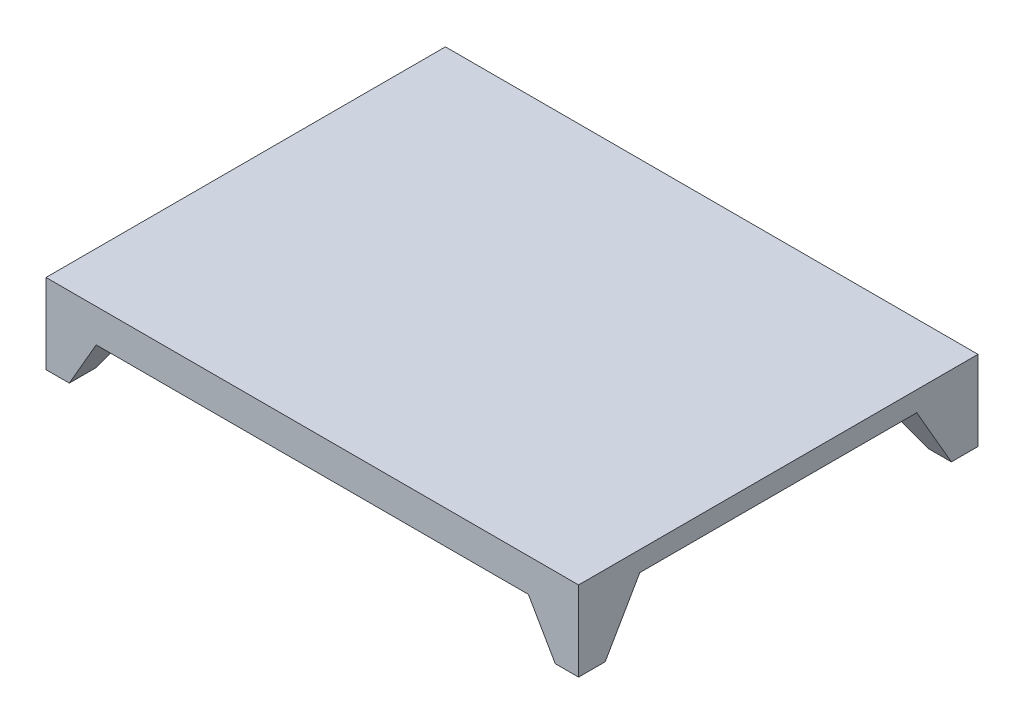
ISO-10303-21;
HEADER;
FILE_DESCRIPTION(('STEP AP214'),'2;1');
FILE_NAME('part.step','',(''),(''),'','','');
FILE_SCHEMA(('AUTOMOTIVE_DESIGN { 1 0 10303 214 1 1 1 1 }'));
ENDSEC;
DATA;
#1=APPLICATION_CONTEXT('core data for automotive mechanical design processes');
#2=APPLICATION_PROTOCOL_DEFINITION('international standard','automotive_design',2000,#1);
#3=PRODUCT_CONTEXT('',#1,'mechanical');
#4=PRODUCT('Part','Part','',(#3));
#5=PRODUCT_RELATED_PRODUCT_CATEGORY('part','',(#4));
#6=PRODUCT_DEFINITION_FORMATION('','',#4);
#7=PRODUCT_DEFINITION_CONTEXT('part definition',#1,'design');
#8=PRODUCT_DEFINITION('design','',#6,#7);
#9=PRODUCT_DEFINITION_SHAPE('','',#8);
#10=(LENGTH_UNIT() NAMED_UNIT(*) SI_UNIT(.MILLI.,.METRE.));
#11=(NAMED_UNIT(*) PLANE_ANGLE_UNIT() SI_UNIT($,.RADIAN.));
#12=(NAMED_UNIT(*) SI_UNIT($,.STERADIAN.) SOLID_ANGLE_UNIT());
#13=UNCERTAINTY_MEASURE_WITH_UNIT(LENGTH_MEASURE(1.E-05),#10,'distance_accuracy_value','');
#14=(GEOMETRIC_REPRESENTATION_CONTEXT(3) GLOBAL_UNCERTAINTY_ASSIGNED_CONTEXT((#13)) GLOBAL_UNIT_ASSIGNED_CONTEXT((#10,
#11,#12)) REPRESENTATION_CONTEXT('',''));
#15=CARTESIAN_POINT('',(0.,0.,0.));
#16=DIRECTION('',(0.,0.,1.));
#17=DIRECTION('',(1.,0.,0.));
#18=AXIS2_PLACEMENT_3D('',#15,#16,#17);
#19=CARTESIAN_POINT('',(-400.,-60.,300.));
#20=DIRECTION('',(0.,1.,0.));
#21=DIRECTION('',(0.,0.,1.));
#22=AXIS2_PLACEMENT_3D('',#19,#20,#21);
#23=PLANE('',#22);
#24=DIRECTION('',(0.,0.,1.));
#25=VECTOR('',#24,1.);
#26=CARTESIAN_POINT('',(-365.,-60.,-300.));
#27=LINE('',#26,#25);
#28=CARTESIAN_POINT('',(-365.,-60.,260.));
#29=VERTEX_POINT('',#28);
#30=CARTESIAN_POINT('',(-365.,-60.,300.));
#31=VERTEX_POINT('',#30);
#32=EDGE_CURVE('E205',#29,#31,#27,.T.);
#33=ORIENTED_EDGE('',*,*,#32,.T.);
#34=DIRECTION('',(1.,0.,0.));
#35=VECTOR('',#34,1.);
#36=CARTESIAN_POINT('',(-400.,-60.,300.));
#37=LINE('',#36,#35);
#38=CARTESIAN_POINT('',(-400.,-60.,300.));
#39=VERTEX_POINT('',#38);
#40=EDGE_CURVE('E231',#39,#31,#37,.T.);
#41=ORIENTED_EDGE('',*,*,#40,.F.);
#42=DIRECTION('',(0.,0.,-1.));
#43=VECTOR('',#42,1.);
#44=CARTESIAN_POINT('',(-400.,-60.,300.));
#45=LINE('',#44,#43);
#46=CARTESIAN_POINT('',(-400.,-60.,260.));
#47=VERTEX_POINT('',#46);
#48=EDGE_CURVE('E182',#39,#47,#45,.T.);
#49=ORIENTED_EDGE('',*,*,#48,.T.);
#50=DIRECTION('',(1.,0.,0.));
#51=VECTOR('',#50,1.);
#52=CARTESIAN_POINT('',(-400.,-60.,260.));
#53=LINE('',#52,#51);
#54=EDGE_CURVE('E234',#47,#29,#53,.T.);
#55=ORIENTED_EDGE('',*,*,#54,.T.);
#56=EDGE_LOOP('',(#33,#41,#49,#55));
#57=FACE_BOUND('',#56,.T.);
#58=ADVANCED_FACE('F33',(#57),#23,.F.);
#59=CARTESIAN_POINT('',(-365.,-60.,-300.));
#60=VERTEX_POINT('',#59);
#61=CARTESIAN_POINT('',(-365.,-60.,-260.));
#62=VERTEX_POINT('',#61);
#63=EDGE_CURVE('E247',#60,#62,#27,.T.);
#64=ORIENTED_EDGE('',*,*,#63,.T.);
#65=DIRECTION('',(1.,0.,0.));
#66=VECTOR('',#65,1.);
#67=CARTESIAN_POINT('',(-400.,-60.,-260.));
#68=LINE('',#67,#66);
#69=CARTESIAN_POINT('',(-400.,-60.,-260.));
#70=VERTEX_POINT('',#69);
#71=EDGE_CURVE('E211',#70,#62,#68,.T.);
#72=ORIENTED_EDGE('',*,*,#71,.F.);
#73=CARTESIAN_POINT('',(-400.,-60.,-300.));
#74=VERTEX_POINT('',#73);
#75=EDGE_CURVE('E180',#70,#74,#45,.T.);
#76=ORIENTED_EDGE('',*,*,#75,.T.);
#77=DIRECTION('',(1.,0.,0.));
#78=VECTOR('',#77,1.);
#79=CARTESIAN_POINT('',(-400.,-60.,-300.));
#80=LINE('',#79,#78);
#81=EDGE_CURVE('E167',#74,#60,#80,.T.);
#82=ORIENTED_EDGE('',*,*,#81,.T.);
#83=EDGE_LOOP('',(#64,#72,#76,#82));
#84=FACE_BOUND('',#83,.T.);
#85=ADVANCED_FACE('F246',(#84),#23,.F.);
#86=CARTESIAN_POINT('',(0.,0.,300.));
#87=DIRECTION('',(0.,0.,-1.));
#88=DIRECTION('',(-1.,0.,0.));
#89=AXIS2_PLACEMENT_3D('',#86,#87,#88);
#90=PLANE('',#89);
#91=DIRECTION('',(0.500000000000004,0.866025403784436,0.));
#92=VECTOR('',#91,1.);
#93=CARTESIAN_POINT('',(-247.769237886465,143.049636190661,300.));
#94=LINE('',#93,#92);
#95=CARTESIAN_POINT('',(-324.585481156726,10.,300.));
#96=VERTEX_POINT('',#95);
#97=EDGE_CURVE('E152',#31,#96,#94,.T.);
#98=ORIENTED_EDGE('',*,*,#97,.T.);
#99=DIRECTION('',(1.,0.,0.));
#100=VECTOR('',#99,1.);
#101=CARTESIAN_POINT('',(0.,10.,300.));
#102=LINE('',#101,#100);
#103=CARTESIAN_POINT('',(324.585481156726,10.,300.));
#104=VERTEX_POINT('',#103);
#105=EDGE_CURVE('E290',#96,#104,#102,.T.);
#106=ORIENTED_EDGE('',*,*,#105,.T.);
#107=DIRECTION('',(-0.500000000000004,0.866025403784437,0.));
#108=VECTOR('',#107,1.);
#109=CARTESIAN_POINT('',(247.769237886465,143.049636190661,300.));
#110=LINE('',#109,#108);
#111=CARTESIAN_POINT('',(365.,-60.,300.));
#112=VERTEX_POINT('',#111);
#113=EDGE_CURVE('E288',#112,#104,#110,.T.);
#114=ORIENTED_EDGE('',*,*,#113,.F.);
#115=CARTESIAN_POINT('',(400.,-60.,300.));
#116=VERTEX_POINT('',#115);
#117=EDGE_CURVE('E230',#112,#116,#37,.T.);
#118=ORIENTED_EDGE('',*,*,#117,.T.);
#119=DIRECTION('',(0.,1.,0.));
#120=VECTOR('',#119,1.);
#121=CARTESIAN_POINT('',(400.,-60.,300.));
#122=LINE('',#121,#120);
#123=CARTESIAN_POINT('',(400.,60.,300.));
#124=VERTEX_POINT('',#123);
#125=EDGE_CURVE('E171',#116,#124,#122,.T.);
#126=ORIENTED_EDGE('',*,*,#125,.T.);
#127=DIRECTION('',(-1.,0.,0.));
#128=VECTOR('',#127,1.);
#129=CARTESIAN_POINT('',(-400.,60.,300.));
#130=LINE('',#129,#128);
#131=CARTESIAN_POINT('',(-400.,60.,300.));
#132=VERTEX_POINT('',#131);
#133=EDGE_CURVE('E226',#124,#132,#130,.T.);
#134=ORIENTED_EDGE('',*,*,#133,.T.);
#135=DIRECTION('',(0.,-1.,0.));
#136=VECTOR('',#135,1.);
#137=CARTESIAN_POINT('',(-400.,-60.,300.));
#138=LINE('',#137,#136);
#139=EDGE_CURVE('E228',#132,#39,#138,.T.);
#140=ORIENTED_EDGE('',*,*,#139,.T.);
#141=ORIENTED_EDGE('',*,*,#40,.T.);
#142=EDGE_LOOP('',(#98,#106,#114,#118,#126,#134,#140,#141));
#143=FACE_BOUND('',#142,.T.);
#144=ADVANCED_FACE('F285',(#143),#90,.F.);
#145=CARTESIAN_POINT('',(0.,0.,-300.));
#146=DIRECTION('',(0.,0.,-1.));
#147=DIRECTION('',(-1.,0.,0.));
#148=AXIS2_PLACEMENT_3D('',#145,#146,#147);
#149=PLANE('',#148);
#150=DIRECTION('',(1.,0.,0.));
#151=VECTOR('',#150,1.);
#152=CARTESIAN_POINT('',(0.,10.,-300.));
#153=LINE('',#152,#151);
#154=CARTESIAN_POINT('',(-324.585481156726,10.,-300.));
#155=VERTEX_POINT('',#154);
#156=CARTESIAN_POINT('',(324.585481156726,10.,-300.));
#157=VERTEX_POINT('',#156);
#158=EDGE_CURVE('E151',#155,#157,#153,.T.);
#159=ORIENTED_EDGE('',*,*,#158,.F.);
#160=DIRECTION('',(0.500000000000004,0.866025403784436,0.));
#161=VECTOR('',#160,1.);
#162=CARTESIAN_POINT('',(-247.769237886465,143.049636190661,-300.));
#163=LINE('',#162,#161);
#164=EDGE_CURVE('E204',#60,#155,#163,.T.);
#165=ORIENTED_EDGE('',*,*,#164,.F.);
#166=ORIENTED_EDGE('',*,*,#81,.F.);
#167=DIRECTION('',(0.,-1.,0.));
#168=VECTOR('',#167,1.);
#169=CARTESIAN_POINT('',(-400.,-60.,-300.));
#170=LINE('',#169,#168);
#171=CARTESIAN_POINT('',(-400.,60.,-300.));
#172=VERTEX_POINT('',#171);
#173=EDGE_CURVE('E168',#172,#74,#170,.T.);
#174=ORIENTED_EDGE('',*,*,#173,.F.);
#175=DIRECTION('',(-1.,0.,0.));
#176=VECTOR('',#175,1.);
#177=CARTESIAN_POINT('',(-400.,60.,-300.));
#178=LINE('',#177,#176);
#179=CARTESIAN_POINT('',(400.,60.,-300.));
#180=VERTEX_POINT('',#179);
#181=EDGE_CURVE('E173',#180,#172,#178,.T.);
#182=ORIENTED_EDGE('',*,*,#181,.F.);
#183=DIRECTION('',(0.,1.,0.));
#184=VECTOR('',#183,1.);
#185=CARTESIAN_POINT('',(400.,-60.,-300.));
#186=LINE('',#185,#184);
#187=CARTESIAN_POINT('',(400.,-60.,-300.));
#188=VERTEX_POINT('',#187);
#189=EDGE_CURVE('E166',#188,#180,#186,.T.);
#190=ORIENTED_EDGE('',*,*,#189,.F.);
#191=CARTESIAN_POINT('',(365.,-60.,-300.));
#192=VERTEX_POINT('',#191);
#193=EDGE_CURVE('E158',#192,#188,#80,.T.);
#194=ORIENTED_EDGE('',*,*,#193,.F.);
#195=DIRECTION('',(-0.500000000000004,0.866025403784437,0.));
#196=VECTOR('',#195,1.);
#197=CARTESIAN_POINT('',(247.769237886465,143.049636190661,-300.));
#198=LINE('',#197,#196);
#199=EDGE_CURVE('E144',#192,#157,#198,.T.);
#200=ORIENTED_EDGE('',*,*,#199,.T.);
#201=EDGE_LOOP('',(#159,#165,#166,#174,#182,#190,#194,#200));
#202=FACE_BOUND('',#201,.T.);
#203=ADVANCED_FACE('F164',(#202),#149,.T.);
#204=CARTESIAN_POINT('',(-400.,97.5833024919774,169.019237886466));
#205=DIRECTION('',(0.,-0.500000000000004,-0.866025403784436));
#206=DIRECTION('',(0.,0.866025403784437,-0.500000000000004));
#207=AXIS2_PLACEMENT_3D('',#204,#205,#206);
#208=PLANE('',#207);
#209=DIRECTION('',(-1.,0.,0.));
#210=VECTOR('',#209,1.);
#211=CARTESIAN_POINT('',(-400.,10.,219.585481156726));
#212=LINE('',#211,#210);
#213=CARTESIAN_POINT('',(324.585481156726,9.99999999999995,219.585481156726));
#214=VERTEX_POINT('',#213);
#215=CARTESIAN_POINT('',(-324.585481156726,10.,219.585481156726));
#216=VERTEX_POINT('',#215);
#217=EDGE_CURVE('E300',#214,#216,#212,.T.);
#218=ORIENTED_EDGE('',*,*,#217,.T.);
#219=DIRECTION('',(-0.447213595499961,-0.77459666924148,0.447213595499961));
#220=VECTOR('',#219,1.);
#221=CARTESIAN_POINT('',(-299.215390309173,53.9422863405994,194.215390309173));
#222=LINE('',#221,#220);
#223=EDGE_CURVE('E257',#216,#29,#222,.T.);
#224=ORIENTED_EDGE('',*,*,#223,.T.);
#225=ORIENTED_EDGE('',*,*,#54,.F.);
#226=DIRECTION('',(0.,0.866025403784436,-0.500000000000004));
#227=VECTOR('',#226,1.);
#228=CARTESIAN_POINT('',(-400.,97.5833024919774,169.019237886466));
#229=LINE('',#228,#227);
#230=CARTESIAN_POINT('',(-400.,30.,208.038475772933));
#231=VERTEX_POINT('',#230);
#232=EDGE_CURVE('E221',#47,#231,#229,.T.);
#233=ORIENTED_EDGE('',*,*,#232,.T.);
#234=DIRECTION('',(1.,0.,0.));
#235=VECTOR('',#234,1.);
#236=CARTESIAN_POINT('',(-400.,30.,208.038475772933));
#237=LINE('',#236,#235);
#238=CARTESIAN_POINT('',(400.,30.,208.038475772933));
#239=VERTEX_POINT('',#238);
#240=EDGE_CURVE('E219',#231,#239,#237,.T.);
#241=ORIENTED_EDGE('',*,*,#240,.T.);
#242=DIRECTION('',(0.,0.866025403784436,-0.500000000000004));
#243=VECTOR('',#242,1.);
#244=CARTESIAN_POINT('',(400.,97.5833024919774,169.019237886466));
#245=LINE('',#244,#243);
#246=CARTESIAN_POINT('',(400.,-60.,260.));
#247=VERTEX_POINT('',#246);
#248=EDGE_CURVE('E250',#247,#239,#245,.T.);
#249=ORIENTED_EDGE('',*,*,#248,.F.);
#250=CARTESIAN_POINT('',(365.,-60.,260.));
#251=VERTEX_POINT('',#250);
#252=EDGE_CURVE('E267',#251,#247,#53,.T.);
#253=ORIENTED_EDGE('',*,*,#252,.F.);
#254=DIRECTION('',(0.44721359549996,-0.77459666924148,0.447213595499961));
#255=VECTOR('',#254,1.);
#256=CARTESIAN_POINT('',(139.215390309171,331.07041555162,34.2153903091711));
#257=LINE('',#256,#255);
#258=EDGE_CURVE('E297',#214,#251,#257,.T.);
#259=ORIENTED_EDGE('',*,*,#258,.F.);
#260=EDGE_LOOP('',(#218,#224,#225,#233,#241,#249,#253,#259));
#261=FACE_BOUND('',#260,.T.);
#262=ADVANCED_FACE('F281',(#261),#208,.T.);
#263=CARTESIAN_POINT('',(-400.,97.5833024919774,-169.019237886466));
#264=DIRECTION('',(0.,0.500000000000004,-0.866025403784436));
#265=DIRECTION('',(0.,0.866025403784437,0.500000000000004));
#266=AXIS2_PLACEMENT_3D('',#263,#264,#265);
#267=PLANE('',#266);
#268=DIRECTION('',(-0.447213595499961,-0.77459666924148,-0.447213595499961));
#269=VECTOR('',#268,1.);
#270=CARTESIAN_POINT('',(-299.215390309173,53.9422863405995,-194.215390309173));
#271=LINE('',#270,#269);
#272=CARTESIAN_POINT('',(-324.585481156726,10.,-219.585481156726));
#273=VERTEX_POINT('',#272);
#274=EDGE_CURVE('E11',#273,#62,#271,.T.);
#275=ORIENTED_EDGE('',*,*,#274,.F.);
#276=DIRECTION('',(-1.,0.,0.));
#277=VECTOR('',#276,1.);
#278=CARTESIAN_POINT('',(-400.,10.,-219.585481156726));
#279=LINE('',#278,#277);
#280=CARTESIAN_POINT('',(324.585481156726,9.99999999999995,-219.585481156726));
#281=VERTEX_POINT('',#280);
#282=EDGE_CURVE('E41',#281,#273,#279,.T.);
#283=ORIENTED_EDGE('',*,*,#282,.F.);
#284=DIRECTION('',(0.44721359549996,-0.77459666924148,-0.447213595499961));
#285=VECTOR('',#284,1.);
#286=CARTESIAN_POINT('',(139.215390309171,331.07041555162,-34.2153903091711));
#287=LINE('',#286,#285);
#288=CARTESIAN_POINT('',(365.,-60.,-260.));
#289=VERTEX_POINT('',#288);
#290=EDGE_CURVE('E191',#281,#289,#287,.T.);
#291=ORIENTED_EDGE('',*,*,#290,.T.);
#292=CARTESIAN_POINT('',(400.,-60.,-260.));
#293=VERTEX_POINT('',#292);
#294=EDGE_CURVE('E160',#289,#293,#68,.T.);
#295=ORIENTED_EDGE('',*,*,#294,.T.);
#296=DIRECTION('',(0.,0.866025403784436,0.500000000000004));
#297=VECTOR('',#296,1.);
#298=CARTESIAN_POINT('',(400.,97.5833024919774,-169.019237886466));
#299=LINE('',#298,#297);
#300=CARTESIAN_POINT('',(400.,30.0000000000001,-208.038475772933));
#301=VERTEX_POINT('',#300);
#302=EDGE_CURVE('E261',#293,#301,#299,.T.);
#303=ORIENTED_EDGE('',*,*,#302,.T.);
#304=DIRECTION('',(1.,0.,0.));
#305=VECTOR('',#304,1.);
#306=CARTESIAN_POINT('',(-400.,30.0000000000001,-208.038475772933));
#307=LINE('',#306,#305);
#308=CARTESIAN_POINT('',(-400.,30.0000000000001,-208.038475772933));
#309=VERTEX_POINT('',#308);
#310=EDGE_CURVE('E217',#309,#301,#307,.T.);
#311=ORIENTED_EDGE('',*,*,#310,.F.);
#312=DIRECTION('',(0.,0.866025403784436,0.500000000000004));
#313=VECTOR('',#312,1.);
#314=CARTESIAN_POINT('',(-400.,97.5833024919774,-169.019237886466));
#315=LINE('',#314,#313);
#316=EDGE_CURVE('E214',#70,#309,#315,.T.);
#317=ORIENTED_EDGE('',*,*,#316,.F.);
#318=ORIENTED_EDGE('',*,*,#71,.T.);
#319=EDGE_LOOP('',(#275,#283,#291,#295,#303,#311,#317,#318));
#320=FACE_BOUND('',#319,.T.);
#321=ADVANCED_FACE('F209',(#320),#267,.F.);
#322=CARTESIAN_POINT('',(400.,-60.,300.));
#323=DIRECTION('',(-1.,0.,0.));
#324=DIRECTION('',(0.,0.,1.));
#325=AXIS2_PLACEMENT_3D('',#322,#323,#324);
#326=PLANE('',#325);
#327=ORIENTED_EDGE('',*,*,#248,.T.);
#328=DIRECTION('',(0.,0.,-1.));
#329=VECTOR('',#328,1.);
#330=CARTESIAN_POINT('',(400.,30.0000000000001,0.));
#331=LINE('',#330,#329);
#332=EDGE_CURVE('E254',#239,#301,#331,.T.);
#333=ORIENTED_EDGE('',*,*,#332,.T.);
#334=ORIENTED_EDGE('',*,*,#302,.F.);
#335=DIRECTION('',(0.,0.,-1.));
#336=VECTOR('',#335,1.);
#337=CARTESIAN_POINT('',(400.,-60.,300.));
#338=LINE('',#337,#336);
#339=EDGE_CURVE('E181',#293,#188,#338,.T.);
#340=ORIENTED_EDGE('',*,*,#339,.T.);
#341=ORIENTED_EDGE('',*,*,#189,.T.);
#342=DIRECTION('',(0.,0.,-1.));
#343=VECTOR('',#342,1.);
#344=CARTESIAN_POINT('',(400.,60.,300.));
#345=LINE('',#344,#343);
#346=EDGE_CURVE('E188',#124,#180,#345,.T.);
#347=ORIENTED_EDGE('',*,*,#346,.F.);
#348=ORIENTED_EDGE('',*,*,#125,.F.);
#349=EDGE_CURVE('E177',#116,#247,#338,.T.);
#350=ORIENTED_EDGE('',*,*,#349,.T.);
#351=EDGE_LOOP('',(#327,#333,#334,#340,#341,#347,#348,#350));
#352=FACE_BOUND('',#351,.T.);
#353=ADVANCED_FACE('F35',(#352),#326,.F.);
#354=CARTESIAN_POINT('',(-400.,-60.,300.));
#355=DIRECTION('',(1.,0.,0.));
#356=DIRECTION('',(0.,0.,-1.));
#357=AXIS2_PLACEMENT_3D('',#354,#355,#356);
#358=PLANE('',#357);
#359=ORIENTED_EDGE('',*,*,#232,.F.);
#360=ORIENTED_EDGE('',*,*,#48,.F.);
#361=ORIENTED_EDGE('',*,*,#139,.F.);
#362=DIRECTION('',(0.,0.,-1.));
#363=VECTOR('',#362,1.);
#364=CARTESIAN_POINT('',(-400.,60.,300.));
#365=LINE('',#364,#363);
#366=EDGE_CURVE('E185',#132,#172,#365,.T.);
#367=ORIENTED_EDGE('',*,*,#366,.T.);
#368=ORIENTED_EDGE('',*,*,#173,.T.);
#369=ORIENTED_EDGE('',*,*,#75,.F.);
#370=ORIENTED_EDGE('',*,*,#316,.T.);
#371=DIRECTION('',(0.,0.,-1.));
#372=VECTOR('',#371,1.);
#373=CARTESIAN_POINT('',(-400.,30.0000000000001,0.));
#374=LINE('',#373,#372);
#375=EDGE_CURVE('E249',#231,#309,#374,.T.);
#376=ORIENTED_EDGE('',*,*,#375,.F.);
#377=EDGE_LOOP('',(#359,#360,#361,#367,#368,#369,#370,#376));
#378=FACE_BOUND('',#377,.T.);
#379=ADVANCED_FACE('F243',(#378),#358,.F.);
#380=ORIENTED_EDGE('',*,*,#117,.F.);
#381=DIRECTION('',(0.,0.,1.));
#382=VECTOR('',#381,1.);
#383=CARTESIAN_POINT('',(365.,-60.,-300.));
#384=LINE('',#383,#382);
#385=EDGE_CURVE('E161',#251,#112,#384,.T.);
#386=ORIENTED_EDGE('',*,*,#385,.F.);
#387=ORIENTED_EDGE('',*,*,#252,.T.);
#388=ORIENTED_EDGE('',*,*,#349,.F.);
#389=EDGE_LOOP('',(#380,#386,#387,#388));
#390=FACE_BOUND('',#389,.T.);
#391=ADVANCED_FACE('F277',(#390),#23,.F.);
#392=CARTESIAN_POINT('',(-400.,60.,300.));
#393=DIRECTION('',(0.,-1.,0.));
#394=DIRECTION('',(0.,0.,-1.));
#395=AXIS2_PLACEMENT_3D('',#392,#393,#394);
#396=PLANE('',#395);
#397=ORIENTED_EDGE('',*,*,#181,.T.);
#398=ORIENTED_EDGE('',*,*,#366,.F.);
#399=ORIENTED_EDGE('',*,*,#133,.F.);
#400=ORIENTED_EDGE('',*,*,#346,.T.);
#401=EDGE_LOOP('',(#397,#398,#399,#400));
#402=FACE_BOUND('',#401,.T.);
#403=ADVANCED_FACE('F237',(#402),#396,.F.);
#404=ORIENTED_EDGE('',*,*,#294,.F.);
#405=EDGE_CURVE('E56',#192,#289,#384,.T.);
#406=ORIENTED_EDGE('',*,*,#405,.F.);
#407=ORIENTED_EDGE('',*,*,#193,.T.);
#408=ORIENTED_EDGE('',*,*,#339,.F.);
#409=EDGE_LOOP('',(#404,#406,#407,#408));
#410=FACE_BOUND('',#409,.T.);
#411=ADVANCED_FACE('F156',(#410),#23,.F.);
#412=CARTESIAN_POINT('',(-400.,30.0000000000001,0.));
#413=DIRECTION('',(0.,-1.,0.));
#414=DIRECTION('',(0.,0.,-1.));
#415=AXIS2_PLACEMENT_3D('',#412,#413,#414);
#416=PLANE('',#415);
#417=ORIENTED_EDGE('',*,*,#332,.F.);
#418=ORIENTED_EDGE('',*,*,#240,.F.);
#419=ORIENTED_EDGE('',*,*,#375,.T.);
#420=ORIENTED_EDGE('',*,*,#310,.T.);
#421=EDGE_LOOP('',(#417,#418,#419,#420));
#422=FACE_BOUND('',#421,.T.);
#423=ADVANCED_FACE('F308',(#422),#416,.T.);
#424=CARTESIAN_POINT('',(247.769237886465,143.049636190661,-300.));
#425=DIRECTION('',(0.866025403784437,0.500000000000004,0.));
#426=DIRECTION('',(-0.500000000000004,0.866025403784437,0.));
#427=AXIS2_PLACEMENT_3D('',#424,#425,#426);
#428=PLANE('',#427);
#429=DIRECTION('',(0.,0.,1.));
#430=VECTOR('',#429,1.);
#431=CARTESIAN_POINT('',(324.585481156726,10.,-300.));
#432=LINE('',#431,#430);
#433=EDGE_CURVE('E147',#157,#281,#432,.T.);
#434=ORIENTED_EDGE('',*,*,#433,.F.);
#435=ORIENTED_EDGE('',*,*,#199,.F.);
#436=ORIENTED_EDGE('',*,*,#405,.T.);
#437=ORIENTED_EDGE('',*,*,#290,.F.);
#438=EDGE_LOOP('',(#434,#435,#436,#437));
#439=FACE_BOUND('',#438,.T.);
#440=ADVANCED_FACE('F145',(#439),#428,.F.);
#441=CARTESIAN_POINT('',(0.,10.,-300.));
#442=DIRECTION('',(0.,-1.,0.));
#443=DIRECTION('',(1.,0.,0.));
#444=AXIS2_PLACEMENT_3D('',#441,#442,#443);
#445=PLANE('',#444);
#446=ORIENTED_EDGE('',*,*,#282,.T.);
#447=DIRECTION('',(0.,0.,1.));
#448=VECTOR('',#447,1.);
#449=CARTESIAN_POINT('',(-324.585481156726,10.,-300.));
#450=LINE('',#449,#448);
#451=EDGE_CURVE('E197',#155,#273,#450,.T.);
#452=ORIENTED_EDGE('',*,*,#451,.F.);
#453=ORIENTED_EDGE('',*,*,#158,.T.);
#454=ORIENTED_EDGE('',*,*,#433,.T.);
#455=EDGE_LOOP('',(#446,#452,#453,#454));
#456=FACE_BOUND('',#455,.T.);
#457=ADVANCED_FACE('F196',(#456),#445,.T.);
#458=CARTESIAN_POINT('',(-247.769237886465,143.049636190661,-300.));
#459=DIRECTION('',(0.866025403784436,-0.500000000000004,0.));
#460=DIRECTION('',(0.500000000000004,0.866025403784436,0.));
#461=AXIS2_PLACEMENT_3D('',#458,#459,#460);
#462=PLANE('',#461);
#463=ORIENTED_EDGE('',*,*,#274,.T.);
#464=ORIENTED_EDGE('',*,*,#63,.F.);
#465=ORIENTED_EDGE('',*,*,#164,.T.);
#466=ORIENTED_EDGE('',*,*,#451,.T.);
#467=EDGE_LOOP('',(#463,#464,#465,#466));
#468=FACE_BOUND('',#467,.T.);
#469=ADVANCED_FACE('F201',(#468),#462,.T.);
#470=EDGE_CURVE('E206',#216,#96,#450,.T.);
#471=ORIENTED_EDGE('',*,*,#470,.T.);
#472=ORIENTED_EDGE('',*,*,#97,.F.);
#473=ORIENTED_EDGE('',*,*,#32,.F.);
#474=ORIENTED_EDGE('',*,*,#223,.F.);
#475=EDGE_LOOP('',(#471,#472,#473,#474));
#476=FACE_BOUND('',#475,.T.);
#477=ADVANCED_FACE('F424',(#476),#462,.T.);
#478=EDGE_CURVE('E48',#214,#104,#432,.T.);
#479=ORIENTED_EDGE('',*,*,#478,.T.);
#480=ORIENTED_EDGE('',*,*,#105,.F.);
#481=ORIENTED_EDGE('',*,*,#470,.F.);
#482=ORIENTED_EDGE('',*,*,#217,.F.);
#483=EDGE_LOOP('',(#479,#480,#481,#482));
#484=FACE_BOUND('',#483,.T.);
#485=ADVANCED_FACE('F416',(#484),#445,.T.);
#486=ORIENTED_EDGE('',*,*,#258,.T.);
#487=ORIENTED_EDGE('',*,*,#385,.T.);
#488=ORIENTED_EDGE('',*,*,#113,.T.);
#489=ORIENTED_EDGE('',*,*,#478,.F.);
#490=EDGE_LOOP('',(#486,#487,#488,#489));
#491=FACE_BOUND('',#490,.T.);
#492=ADVANCED_FACE('F317',(#491),#428,.F.);
#493=CLOSED_SHELL('',(#58,#85,#144,#203,#262,#321,#353,#379,#391,#403,#411,#423,#440,#457,#469,
#477,#485,#492));
#494=MANIFOLD_SOLID_BREP('B2',#493);
#495=ADVANCED_BREP_SHAPE_REPRESENTATION('',(#18,#494),#14);
#496=SHAPE_DEFINITION_REPRESENTATION(#9,#495);
ENDSEC;
END-ISO-10303-21;
